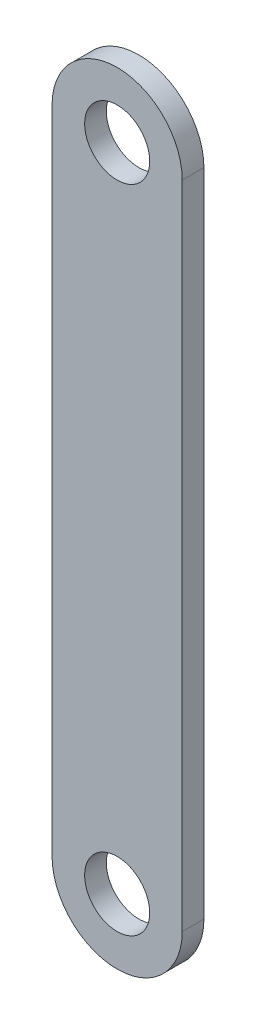
ISO-10303-21;
HEADER;
FILE_DESCRIPTION(('STEP AP214'),'2;1');
FILE_NAME('part.step','',(''),(''),'','','');
FILE_SCHEMA(('AUTOMOTIVE_DESIGN { 1 0 10303 214 1 1 1 1 }'));
ENDSEC;
DATA;
#1=APPLICATION_CONTEXT('core data for automotive mechanical design processes');
#2=APPLICATION_PROTOCOL_DEFINITION('international standard','automotive_design',2000,#1);
#3=PRODUCT_CONTEXT('',#1,'mechanical');
#4=PRODUCT('Part','Part','',(#3));
#5=PRODUCT_RELATED_PRODUCT_CATEGORY('part','',(#4));
#6=PRODUCT_DEFINITION_FORMATION('','',#4);
#7=PRODUCT_DEFINITION_CONTEXT('part definition',#1,'design');
#8=PRODUCT_DEFINITION('design','',#6,#7);
#9=PRODUCT_DEFINITION_SHAPE('','',#8);
#10=(LENGTH_UNIT() NAMED_UNIT(*) SI_UNIT(.MILLI.,.METRE.));
#11=(NAMED_UNIT(*) PLANE_ANGLE_UNIT() SI_UNIT($,.RADIAN.));
#12=(NAMED_UNIT(*) SI_UNIT($,.STERADIAN.) SOLID_ANGLE_UNIT());
#13=UNCERTAINTY_MEASURE_WITH_UNIT(LENGTH_MEASURE(1.E-05),#10,'distance_accuracy_value','');
#14=(GEOMETRIC_REPRESENTATION_CONTEXT(3) GLOBAL_UNCERTAINTY_ASSIGNED_CONTEXT((#13)) GLOBAL_UNIT_ASSIGNED_CONTEXT((#10,
#11,#12)) REPRESENTATION_CONTEXT('',''));
#15=CARTESIAN_POINT('',(0.,0.,0.));
#16=DIRECTION('',(0.,0.,1.));
#17=DIRECTION('',(1.,0.,0.));
#18=AXIS2_PLACEMENT_3D('',#15,#16,#17);
#19=CARTESIAN_POINT('',(-3.,-30.,0.));
#20=DIRECTION('',(1.,0.,0.));
#21=DIRECTION('',(0.,1.,0.));
#22=AXIS2_PLACEMENT_3D('',#19,#20,#21);
#23=PLANE('',#22);
#24=DIRECTION('',(0.,0.,-1.));
#25=VECTOR('',#24,1.);
#26=CARTESIAN_POINT('',(-3.,-30.0000000005388,0.5));
#27=LINE('',#26,#25);
#28=CARTESIAN_POINT('',(-3.,-30.0000000002694,0.));
#29=VERTEX_POINT('',#28);
#30=CARTESIAN_POINT('',(-3.,-30.0000000002694,1.));
#31=VERTEX_POINT('',#30);
#32=EDGE_CURVE('E72',#29,#31,#27,.F.);
#33=ORIENTED_EDGE('',*,*,#32,.T.);
#34=DIRECTION('',(0.,-1.,0.));
#35=VECTOR('',#34,1.);
#36=CARTESIAN_POINT('',(-3.,-15.,1.));
#37=LINE('',#36,#35);
#38=CARTESIAN_POINT('',(-3.,0.,1.));
#39=VERTEX_POINT('',#38);
#40=EDGE_CURVE('E69',#39,#31,#37,.T.);
#41=ORIENTED_EDGE('',*,*,#40,.F.);
#42=DIRECTION('',(0.,0.,1.));
#43=VECTOR('',#42,1.);
#44=CARTESIAN_POINT('',(-3.,0.,0.5));
#45=LINE('',#44,#43);
#46=CARTESIAN_POINT('',(-3.,0.,0.));
#47=VERTEX_POINT('',#46);
#48=EDGE_CURVE('E59',#39,#47,#45,.F.);
#49=ORIENTED_EDGE('',*,*,#48,.T.);
#50=DIRECTION('',(0.,-1.,0.));
#51=VECTOR('',#50,1.);
#52=CARTESIAN_POINT('',(-3.,-15.,0.));
#53=LINE('',#52,#51);
#54=EDGE_CURVE('E94',#47,#29,#53,.T.);
#55=ORIENTED_EDGE('',*,*,#54,.T.);
#56=EDGE_LOOP('',(#33,#41,#49,#55));
#57=FACE_BOUND('',#56,.T.);
#58=ADVANCED_FACE('F17',(#57),#23,.F.);
#59=CARTESIAN_POINT('',(0.,-30.,1.));
#60=DIRECTION('',(0.,0.,-1.));
#61=DIRECTION('',(-1.,0.,0.));
#62=AXIS2_PLACEMENT_3D('',#59,#60,#61);
#63=CYLINDRICAL_SURFACE('',#62,3.);
#64=DIRECTION('',(0.,0.,1.));
#65=VECTOR('',#64,1.);
#66=CARTESIAN_POINT('',(3.,-30.,0.5));
#67=LINE('',#66,#65);
#68=CARTESIAN_POINT('',(3.,-30.,0.));
#69=VERTEX_POINT('',#68);
#70=CARTESIAN_POINT('',(3.,-30.,1.));
#71=VERTEX_POINT('',#70);
#72=EDGE_CURVE('E80',#69,#71,#67,.T.);
#73=ORIENTED_EDGE('',*,*,#72,.T.);
#74=CARTESIAN_POINT('',(0.,-30.,1.));
#75=DIRECTION('',(0.,0.,-1.));
#76=DIRECTION('',(-1.,0.,0.));
#77=AXIS2_PLACEMENT_3D('',#74,#75,#76);
#78=CIRCLE('',#77,3.);
#79=EDGE_CURVE('E74',#31,#71,#78,.F.);
#80=ORIENTED_EDGE('',*,*,#79,.F.);
#81=ORIENTED_EDGE('',*,*,#32,.F.);
#82=CARTESIAN_POINT('',(0.,-30.,0.));
#83=DIRECTION('',(0.,0.,-1.));
#84=DIRECTION('',(-1.,0.,0.));
#85=AXIS2_PLACEMENT_3D('',#82,#83,#84);
#86=CIRCLE('',#85,3.);
#87=EDGE_CURVE('E91',#29,#69,#86,.F.);
#88=ORIENTED_EDGE('',*,*,#87,.T.);
#89=EDGE_LOOP('',(#73,#80,#81,#88));
#90=FACE_BOUND('',#89,.T.);
#91=ADVANCED_FACE('F105',(#90),#63,.T.);
#92=CARTESIAN_POINT('',(3.,0.,0.));
#93=DIRECTION('',(-1.,0.,0.));
#94=DIRECTION('',(0.,-1.,0.));
#95=AXIS2_PLACEMENT_3D('',#92,#93,#94);
#96=PLANE('',#95);
#97=DIRECTION('',(0.,0.,-1.));
#98=VECTOR('',#97,1.);
#99=CARTESIAN_POINT('',(3.,-1.23062057109199E-09,0.5));
#100=LINE('',#99,#98);
#101=CARTESIAN_POINT('',(3.,-6.15310285545994E-10,0.));
#102=VERTEX_POINT('',#101);
#103=CARTESIAN_POINT('',(3.,-6.15310285545994E-10,1.));
#104=VERTEX_POINT('',#103);
#105=EDGE_CURVE('E36',#102,#104,#100,.F.);
#106=ORIENTED_EDGE('',*,*,#105,.T.);
#107=DIRECTION('',(0.,1.,0.));
#108=VECTOR('',#107,1.);
#109=CARTESIAN_POINT('',(3.,-15.,1.));
#110=LINE('',#109,#108);
#111=EDGE_CURVE('E71',#71,#104,#110,.T.);
#112=ORIENTED_EDGE('',*,*,#111,.F.);
#113=ORIENTED_EDGE('',*,*,#72,.F.);
#114=DIRECTION('',(0.,1.,0.));
#115=VECTOR('',#114,1.);
#116=CARTESIAN_POINT('',(3.,-15.,0.));
#117=LINE('',#116,#115);
#118=EDGE_CURVE('E90',#69,#102,#117,.T.);
#119=ORIENTED_EDGE('',*,*,#118,.T.);
#120=EDGE_LOOP('',(#106,#112,#113,#119));
#121=FACE_BOUND('',#120,.T.);
#122=ADVANCED_FACE('F101',(#121),#96,.F.);
#123=CARTESIAN_POINT('',(0.,0.,1.));
#124=DIRECTION('',(0.,0.,-1.));
#125=DIRECTION('',(-1.,0.,0.));
#126=AXIS2_PLACEMENT_3D('',#123,#124,#125);
#127=CYLINDRICAL_SURFACE('',#126,3.);
#128=ORIENTED_EDGE('',*,*,#48,.F.);
#129=CARTESIAN_POINT('',(0.,0.,1.));
#130=DIRECTION('',(0.,0.,-1.));
#131=DIRECTION('',(-1.,0.,0.));
#132=AXIS2_PLACEMENT_3D('',#129,#130,#131);
#133=CIRCLE('',#132,3.);
#134=EDGE_CURVE('E21',#104,#39,#133,.F.);
#135=ORIENTED_EDGE('',*,*,#134,.F.);
#136=ORIENTED_EDGE('',*,*,#105,.F.);
#137=CARTESIAN_POINT('',(0.,0.,0.));
#138=DIRECTION('',(0.,0.,-1.));
#139=DIRECTION('',(-1.,0.,0.));
#140=AXIS2_PLACEMENT_3D('',#137,#138,#139);
#141=CIRCLE('',#140,3.);
#142=EDGE_CURVE('E62',#102,#47,#141,.F.);
#143=ORIENTED_EDGE('',*,*,#142,.T.);
#144=EDGE_LOOP('',(#128,#135,#136,#143));
#145=FACE_BOUND('',#144,.T.);
#146=ADVANCED_FACE('F61',(#145),#127,.T.);
#147=CARTESIAN_POINT('',(0.,0.,1.));
#148=DIRECTION('',(0.,0.,-1.));
#149=DIRECTION('',(-1.,0.,0.));
#150=AXIS2_PLACEMENT_3D('',#147,#148,#149);
#151=CYLINDRICAL_SURFACE('',#150,1.5);
#152=CARTESIAN_POINT('',(0.,0.,0.));
#153=DIRECTION('',(0.,0.,-1.));
#154=DIRECTION('',(-1.,0.,0.));
#155=AXIS2_PLACEMENT_3D('',#152,#153,#154);
#156=CIRCLE('',#155,1.5);
#157=CARTESIAN_POINT('',(-1.5,0.,0.));
#158=VERTEX_POINT('',#157);
#159=EDGE_CURVE('E86',#158,#158,#156,.T.);
#160=ORIENTED_EDGE('',*,*,#159,.T.);
#161=EDGE_LOOP('',(#160));
#162=FACE_BOUND('',#161,.T.);
#163=CARTESIAN_POINT('',(0.,0.,1.));
#164=DIRECTION('',(0.,0.,-1.));
#165=DIRECTION('',(-1.,0.,0.));
#166=AXIS2_PLACEMENT_3D('',#163,#164,#165);
#167=CIRCLE('',#166,1.5);
#168=CARTESIAN_POINT('',(-1.5,0.,1.));
#169=VERTEX_POINT('',#168);
#170=EDGE_CURVE('E95',#169,#169,#167,.T.);
#171=ORIENTED_EDGE('',*,*,#170,.F.);
#172=EDGE_LOOP('',(#171));
#173=FACE_BOUND('',#172,.T.);
#174=ADVANCED_FACE('F126',(#162,#173),#151,.F.);
#175=CARTESIAN_POINT('',(-3.,-33.216,1.));
#176=DIRECTION('',(0.,0.,1.));
#177=DIRECTION('',(1.,0.,0.));
#178=AXIS2_PLACEMENT_3D('',#175,#176,#177);
#179=PLANE('',#178);
#180=CARTESIAN_POINT('',(0.,-30.,1.));
#181=DIRECTION('',(0.,0.,-1.));
#182=DIRECTION('',(-1.,0.,0.));
#183=AXIS2_PLACEMENT_3D('',#180,#181,#182);
#184=CIRCLE('',#183,1.5);
#185=CARTESIAN_POINT('',(-1.5,-30.,1.));
#186=VERTEX_POINT('',#185);
#187=EDGE_CURVE('E27',#186,#186,#184,.F.);
#188=ORIENTED_EDGE('',*,*,#187,.F.);
#189=EDGE_LOOP('',(#188));
#190=FACE_BOUND('',#189,.T.);
#191=ORIENTED_EDGE('',*,*,#170,.T.);
#192=EDGE_LOOP('',(#191));
#193=FACE_BOUND('',#192,.T.);
#194=ORIENTED_EDGE('',*,*,#79,.T.);
#195=ORIENTED_EDGE('',*,*,#111,.T.);
#196=ORIENTED_EDGE('',*,*,#134,.T.);
#197=ORIENTED_EDGE('',*,*,#40,.T.);
#198=EDGE_LOOP('',(#194,#195,#196,#197));
#199=FACE_BOUND('',#198,.T.);
#200=ADVANCED_FACE('F68',(#190,#193,#199),#179,.T.);
#201=CARTESIAN_POINT('',(-3.,-33.216,0.));
#202=DIRECTION('',(0.,0.,1.));
#203=DIRECTION('',(1.,0.,0.));
#204=AXIS2_PLACEMENT_3D('',#201,#202,#203);
#205=PLANE('',#204);
#206=CARTESIAN_POINT('',(0.,-30.,0.));
#207=DIRECTION('',(0.,0.,-1.));
#208=DIRECTION('',(-1.,0.,0.));
#209=AXIS2_PLACEMENT_3D('',#206,#207,#208);
#210=CIRCLE('',#209,1.5);
#211=CARTESIAN_POINT('',(-1.5,-30.,0.));
#212=VERTEX_POINT('',#211);
#213=EDGE_CURVE('E11',#212,#212,#210,.T.);
#214=ORIENTED_EDGE('',*,*,#213,.F.);
#215=EDGE_LOOP('',(#214));
#216=FACE_BOUND('',#215,.T.);
#217=ORIENTED_EDGE('',*,*,#159,.F.);
#218=EDGE_LOOP('',(#217));
#219=FACE_BOUND('',#218,.T.);
#220=ORIENTED_EDGE('',*,*,#118,.F.);
#221=ORIENTED_EDGE('',*,*,#87,.F.);
#222=ORIENTED_EDGE('',*,*,#54,.F.);
#223=ORIENTED_EDGE('',*,*,#142,.F.);
#224=EDGE_LOOP('',(#220,#221,#222,#223));
#225=FACE_BOUND('',#224,.T.);
#226=ADVANCED_FACE('F19',(#216,#219,#225),#205,.F.);
#227=CARTESIAN_POINT('',(0.,-30.,1.));
#228=DIRECTION('',(0.,0.,-1.));
#229=DIRECTION('',(-1.,0.,0.));
#230=AXIS2_PLACEMENT_3D('',#227,#228,#229);
#231=CYLINDRICAL_SURFACE('',#230,1.5);
#232=ORIENTED_EDGE('',*,*,#187,.T.);
#233=EDGE_LOOP('',(#232));
#234=FACE_BOUND('',#233,.T.);
#235=ORIENTED_EDGE('',*,*,#213,.T.);
#236=EDGE_LOOP('',(#235));
#237=FACE_BOUND('',#236,.T.);
#238=ADVANCED_FACE('F116',(#234,#237),#231,.F.);
#239=CLOSED_SHELL('',(#58,#91,#122,#146,#174,#200,#226,#238));
#240=MANIFOLD_SOLID_BREP('B1',#239);
#241=ADVANCED_BREP_SHAPE_REPRESENTATION('',(#18,#240),#14);
#242=SHAPE_DEFINITION_REPRESENTATION(#9,#241);
ENDSEC;
END-ISO-10303-21;
